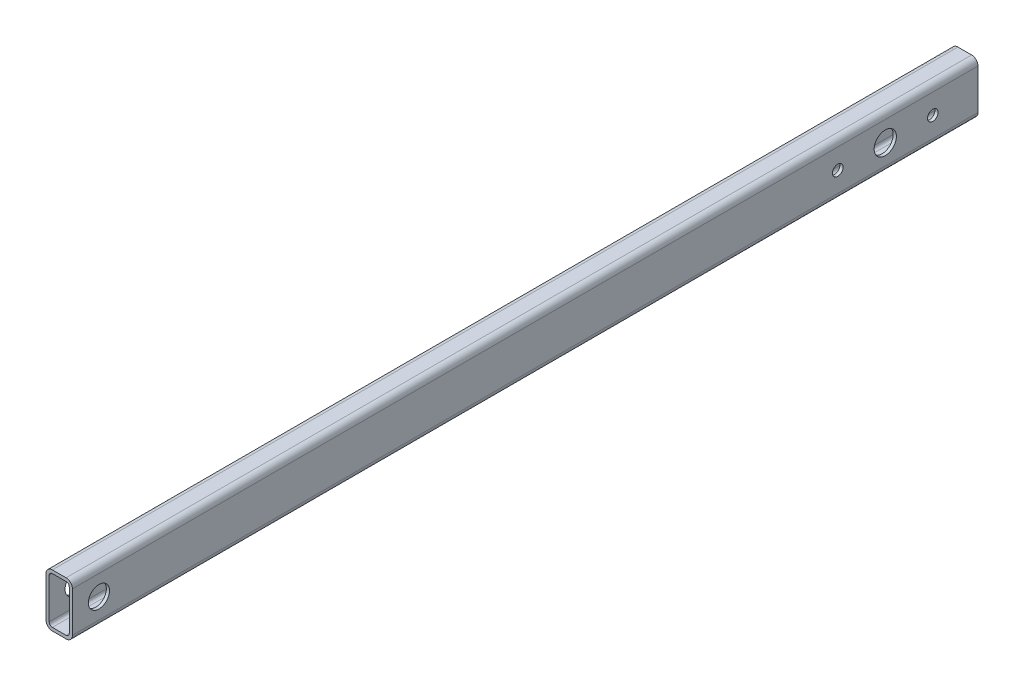
ISO-10303-21;
HEADER;
FILE_DESCRIPTION(('STEP AP214'),'2;1');
FILE_NAME('part.step','',(''),(''),'','','');
FILE_SCHEMA(('AUTOMOTIVE_DESIGN { 1 0 10303 214 1 1 1 1 }'));
ENDSEC;
DATA;
#1=APPLICATION_CONTEXT('core data for automotive mechanical design processes');
#2=APPLICATION_PROTOCOL_DEFINITION('international standard','automotive_design',2000,#1);
#3=PRODUCT_CONTEXT('',#1,'mechanical');
#4=PRODUCT('Part','Part','',(#3));
#5=PRODUCT_RELATED_PRODUCT_CATEGORY('part','',(#4));
#6=PRODUCT_DEFINITION_FORMATION('','',#4);
#7=PRODUCT_DEFINITION_CONTEXT('part definition',#1,'design');
#8=PRODUCT_DEFINITION('design','',#6,#7);
#9=PRODUCT_DEFINITION_SHAPE('','',#8);
#10=(LENGTH_UNIT() NAMED_UNIT(*) SI_UNIT(.MILLI.,.METRE.));
#11=(NAMED_UNIT(*) PLANE_ANGLE_UNIT() SI_UNIT($,.RADIAN.));
#12=(NAMED_UNIT(*) SI_UNIT($,.STERADIAN.) SOLID_ANGLE_UNIT());
#13=UNCERTAINTY_MEASURE_WITH_UNIT(LENGTH_MEASURE(1.E-05),#10,'distance_accuracy_value','');
#14=(GEOMETRIC_REPRESENTATION_CONTEXT(3) GLOBAL_UNCERTAINTY_ASSIGNED_CONTEXT((#13)) GLOBAL_UNIT_ASSIGNED_CONTEXT((#10,
#11,#12)) REPRESENTATION_CONTEXT('',''));
#15=CARTESIAN_POINT('',(0.,0.,0.));
#16=DIRECTION('',(0.,0.,1.));
#17=DIRECTION('',(1.,0.,0.));
#18=AXIS2_PLACEMENT_3D('',#15,#16,#17);
#19=CARTESIAN_POINT('',(6.00000000000009,5.99999999999989,-70.));
#20=DIRECTION('',(0.,0.,1.));
#21=DIRECTION('',(1.00000000000001,0.,0.));
#22=AXIS2_PLACEMENT_3D('',#19,#20,#21);
#23=CYLINDRICAL_SURFACE('',#22,6.);
#24=DIRECTION('',(0.,0.,1.));
#25=VECTOR('',#24,1.);
#26=CARTESIAN_POINT('',(6.00000000000009,0.,-70.0000000000003));
#27=LINE('',#26,#25);
#28=CARTESIAN_POINT('',(6.00000000000009,0.,-70.0000000000003));
#29=VERTEX_POINT('',#28);
#30=CARTESIAN_POINT('',(6.00000000000001,0.,785.));
#31=VERTEX_POINT('',#30);
#32=EDGE_CURVE('E272',#29,#31,#27,.T.);
#33=ORIENTED_EDGE('',*,*,#32,.T.);
#34=CARTESIAN_POINT('',(6.00000000000001,6.00000000000001,785.));
#35=DIRECTION('',(0.,0.,1.));
#36=DIRECTION('',(-1.00000000000001,0.,0.));
#37=AXIS2_PLACEMENT_3D('',#34,#35,#36);
#38=CIRCLE('',#37,6.);
#39=CARTESIAN_POINT('',(0.,6.00000000000001,785.));
#40=VERTEX_POINT('',#39);
#41=EDGE_CURVE('E196',#40,#31,#38,.T.);
#42=ORIENTED_EDGE('',*,*,#41,.F.);
#43=DIRECTION('',(0.,0.,1.));
#44=VECTOR('',#43,1.);
#45=CARTESIAN_POINT('',(0.,5.99999999999989,-70.0000000000006));
#46=LINE('',#45,#44);
#47=CARTESIAN_POINT('',(0.,5.99999999999989,-70.0000000000006));
#48=VERTEX_POINT('',#47);
#49=EDGE_CURVE('E11',#48,#40,#46,.T.);
#50=ORIENTED_EDGE('',*,*,#49,.F.);
#51=CARTESIAN_POINT('',(6.00000000000009,5.99999999999989,-70.));
#52=DIRECTION('',(0.,0.,1.));
#53=DIRECTION('',(-1.00000000000001,0.,0.));
#54=AXIS2_PLACEMENT_3D('',#51,#52,#53);
#55=CIRCLE('',#54,6.);
#56=EDGE_CURVE('E239',#48,#29,#55,.T.);
#57=ORIENTED_EDGE('',*,*,#56,.T.);
#58=EDGE_LOOP('',(#33,#42,#50,#57));
#59=FACE_BOUND('',#58,.T.);
#60=ADVANCED_FACE('F38',(#59),#23,.T.);
#61=CARTESIAN_POINT('',(0.,43.9999999999999,-70.));
#62=DIRECTION('',(-1.00000000000001,0.,0.));
#63=DIRECTION('',(0.,0.,1.));
#64=AXIS2_PLACEMENT_3D('',#61,#62,#63);
#65=PLANE('',#64);
#66=CARTESIAN_POINT('',(0.,24.9999999999998,-27.2997088405868));
#67=DIRECTION('',(1.00000000000001,0.,0.));
#68=DIRECTION('',(0.,1.00000000000001,0.));
#69=AXIS2_PLACEMENT_3D('',#66,#67,#68);
#70=CIRCLE('',#69,5.);
#71=CARTESIAN_POINT('',(0.,29.9999999999998,-27.2997088405868));
#72=VERTEX_POINT('',#71);
#73=EDGE_CURVE('E454',#72,#72,#70,.T.);
#74=ORIENTED_EDGE('',*,*,#73,.T.);
#75=EDGE_LOOP('',(#74));
#76=FACE_BOUND('',#75,.T.);
#77=CARTESIAN_POINT('',(0.,24.9999999999998,760.));
#78=DIRECTION('',(1.00000000000001,0.,0.));
#79=DIRECTION('',(0.,1.00000000000001,0.));
#80=AXIS2_PLACEMENT_3D('',#77,#78,#79);
#81=CIRCLE('',#80,9.99999999999998);
#82=CARTESIAN_POINT('',(0.,34.9999999999998,760.));
#83=VERTEX_POINT('',#82);
#84=EDGE_CURVE('E459',#83,#83,#81,.T.);
#85=ORIENTED_EDGE('',*,*,#84,.T.);
#86=EDGE_LOOP('',(#85));
#87=FACE_BOUND('',#86,.T.);
#88=CARTESIAN_POINT('',(0.,25.0000000000001,62.4002911594126));
#89=DIRECTION('',(1.00000000000001,0.,0.));
#90=DIRECTION('',(0.,1.00000000000001,0.));
#91=AXIS2_PLACEMENT_3D('',#88,#89,#90);
#92=CIRCLE('',#91,5.);
#93=CARTESIAN_POINT('',(0.,30.0000000000002,62.4002911594126));
#94=VERTEX_POINT('',#93);
#95=EDGE_CURVE('E451',#94,#94,#92,.T.);
#96=ORIENTED_EDGE('',*,*,#95,.T.);
#97=EDGE_LOOP('',(#96));
#98=FACE_BOUND('',#97,.T.);
#99=CARTESIAN_POINT('',(0.,25.0000000000001,17.5502911594126));
#100=DIRECTION('',(1.00000000000001,0.,0.));
#101=DIRECTION('',(0.,1.00000000000001,0.));
#102=AXIS2_PLACEMENT_3D('',#99,#100,#101);
#103=CIRCLE('',#102,10.5);
#104=CARTESIAN_POINT('',(0.,35.5000000000002,17.5502911594126));
#105=VERTEX_POINT('',#104);
#106=EDGE_CURVE('E290',#105,#105,#103,.T.);
#107=ORIENTED_EDGE('',*,*,#106,.T.);
#108=EDGE_LOOP('',(#107));
#109=FACE_BOUND('',#108,.T.);
#110=ORIENTED_EDGE('',*,*,#49,.T.);
#111=DIRECTION('',(0.,-1.00000000000001,0.));
#112=VECTOR('',#111,1.);
#113=CARTESIAN_POINT('',(0.,44.,785.));
#114=LINE('',#113,#112);
#115=CARTESIAN_POINT('',(0.,44.,785.));
#116=VERTEX_POINT('',#115);
#117=EDGE_CURVE('E217',#116,#40,#114,.T.);
#118=ORIENTED_EDGE('',*,*,#117,.F.);
#119=DIRECTION('',(0.,0.,1.));
#120=VECTOR('',#119,1.);
#121=CARTESIAN_POINT('',(0.,43.9999999999999,-70.));
#122=LINE('',#121,#120);
#123=CARTESIAN_POINT('',(0.,43.9999999999999,-70.));
#124=VERTEX_POINT('',#123);
#125=EDGE_CURVE('E46',#124,#116,#122,.T.);
#126=ORIENTED_EDGE('',*,*,#125,.F.);
#127=DIRECTION('',(0.,-1.00000000000001,0.));
#128=VECTOR('',#127,1.);
#129=CARTESIAN_POINT('',(0.,43.9999999999999,-70.));
#130=LINE('',#129,#128);
#131=EDGE_CURVE('E270',#124,#48,#130,.T.);
#132=ORIENTED_EDGE('',*,*,#131,.T.);
#133=EDGE_LOOP('',(#110,#118,#126,#132));
#134=FACE_BOUND('',#133,.T.);
#135=ADVANCED_FACE('F338',(#76,#87,#98,#109,#134),#65,.T.);
#136=CARTESIAN_POINT('',(6.00000000000009,43.9999999999999,-70.0000000000003));
#137=DIRECTION('',(0.,0.,1.));
#138=DIRECTION('',(1.00000000000001,0.,0.));
#139=AXIS2_PLACEMENT_3D('',#136,#137,#138);
#140=CYLINDRICAL_SURFACE('',#139,6.);
#141=ORIENTED_EDGE('',*,*,#125,.T.);
#142=CARTESIAN_POINT('',(6.00000000000009,44.,785.));
#143=DIRECTION('',(0.,0.,1.));
#144=DIRECTION('',(1.00000000000001,0.,0.));
#145=AXIS2_PLACEMENT_3D('',#142,#143,#144);
#146=CIRCLE('',#145,6.);
#147=CARTESIAN_POINT('',(6.00000000000009,50.,785.));
#148=VERTEX_POINT('',#147);
#149=EDGE_CURVE('E214',#148,#116,#146,.T.);
#150=ORIENTED_EDGE('',*,*,#149,.F.);
#151=DIRECTION('',(0.,0.,1.));
#152=VECTOR('',#151,1.);
#153=CARTESIAN_POINT('',(6.00000000000009,50.,-70.0000000000003));
#154=LINE('',#153,#152);
#155=CARTESIAN_POINT('',(6.00000000000009,50.,-70.0000000000003));
#156=VERTEX_POINT('',#155);
#157=EDGE_CURVE('E275',#156,#148,#154,.T.);
#158=ORIENTED_EDGE('',*,*,#157,.F.);
#159=CARTESIAN_POINT('',(6.00000000000009,43.9999999999999,-70.0000000000003));
#160=DIRECTION('',(0.,0.,1.));
#161=DIRECTION('',(1.00000000000001,0.,0.));
#162=AXIS2_PLACEMENT_3D('',#159,#160,#161);
#163=CIRCLE('',#162,6.);
#164=EDGE_CURVE('E267',#156,#124,#163,.T.);
#165=ORIENTED_EDGE('',*,*,#164,.T.);
#166=EDGE_LOOP('',(#141,#150,#158,#165));
#167=FACE_BOUND('',#166,.T.);
#168=ADVANCED_FACE('F342',(#167),#140,.T.);
#169=CARTESIAN_POINT('',(6.00000000000009,50.,-70.0000000000003));
#170=DIRECTION('',(0.,1.00000000000001,0.));
#171=DIRECTION('',(0.,0.,1.));
#172=AXIS2_PLACEMENT_3D('',#169,#170,#171);
#173=PLANE('',#172);
#174=ORIENTED_EDGE('',*,*,#157,.T.);
#175=DIRECTION('',(-1.00000000000001,0.,0.));
#176=VECTOR('',#175,1.);
#177=CARTESIAN_POINT('',(6.00000000000009,50.,785.));
#178=LINE('',#177,#176);
#179=CARTESIAN_POINT('',(18.9611964303453,50.,785.));
#180=VERTEX_POINT('',#179);
#181=EDGE_CURVE('E211',#180,#148,#178,.T.);
#182=ORIENTED_EDGE('',*,*,#181,.F.);
#183=DIRECTION('',(0.,0.,1.));
#184=VECTOR('',#183,1.);
#185=CARTESIAN_POINT('',(18.9611964303453,50.,-70.0000000000003));
#186=LINE('',#185,#184);
#187=CARTESIAN_POINT('',(18.9611964303453,50.,-70.0000000000003));
#188=VERTEX_POINT('',#187);
#189=EDGE_CURVE('E277',#188,#180,#186,.T.);
#190=ORIENTED_EDGE('',*,*,#189,.F.);
#191=DIRECTION('',(-1.00000000000001,0.,0.));
#192=VECTOR('',#191,1.);
#193=CARTESIAN_POINT('',(6.00000000000009,50.,-70.0000000000003));
#194=LINE('',#193,#192);
#195=EDGE_CURVE('E264',#188,#156,#194,.T.);
#196=ORIENTED_EDGE('',*,*,#195,.T.);
#197=EDGE_LOOP('',(#174,#182,#190,#196));
#198=FACE_BOUND('',#197,.T.);
#199=ADVANCED_FACE('F371',(#198),#173,.T.);
#200=CARTESIAN_POINT('',(18.9611964303453,44.,-70.0000000000003));
#201=DIRECTION('',(0.,0.,1.));
#202=DIRECTION('',(1.00000000000001,0.,0.));
#203=AXIS2_PLACEMENT_3D('',#200,#201,#202);
#204=CYLINDRICAL_SURFACE('',#203,6.00000000000001);
#205=ORIENTED_EDGE('',*,*,#189,.T.);
#206=CARTESIAN_POINT('',(18.9611964303453,44.,785.));
#207=DIRECTION('',(0.,0.,1.));
#208=DIRECTION('',(-1.00000000000001,0.,0.));
#209=AXIS2_PLACEMENT_3D('',#206,#207,#208);
#210=CIRCLE('',#209,6.00000000000001);
#211=CARTESIAN_POINT('',(24.9611964303453,44.,785.));
#212=VERTEX_POINT('',#211);
#213=EDGE_CURVE('E208',#212,#180,#210,.T.);
#214=ORIENTED_EDGE('',*,*,#213,.F.);
#215=DIRECTION('',(0.,0.,1.));
#216=VECTOR('',#215,1.);
#217=CARTESIAN_POINT('',(24.9611964303459,44.,-70.0000000000003));
#218=LINE('',#217,#216);
#219=CARTESIAN_POINT('',(24.9611964303459,44.,-70.0000000000003));
#220=VERTEX_POINT('',#219);
#221=EDGE_CURVE('E279',#220,#212,#218,.T.);
#222=ORIENTED_EDGE('',*,*,#221,.F.);
#223=CARTESIAN_POINT('',(18.9611964303453,44.,-70.0000000000003));
#224=DIRECTION('',(0.,0.,1.));
#225=DIRECTION('',(-1.00000000000001,0.,0.));
#226=AXIS2_PLACEMENT_3D('',#223,#224,#225);
#227=CIRCLE('',#226,6.00000000000001);
#228=EDGE_CURVE('E261',#220,#188,#227,.T.);
#229=ORIENTED_EDGE('',*,*,#228,.T.);
#230=EDGE_LOOP('',(#205,#214,#222,#229));
#231=FACE_BOUND('',#230,.T.);
#232=ADVANCED_FACE('F369',(#231),#204,.T.);
#233=CARTESIAN_POINT('',(24.9611964303459,44.,-70.0000000000003));
#234=DIRECTION('',(1.00000000000001,0.,0.));
#235=DIRECTION('',(0.,1.00000000000001,0.));
#236=AXIS2_PLACEMENT_3D('',#233,#234,#235);
#237=PLANE('',#236);
#238=CARTESIAN_POINT('',(24.9611964303452,24.9999999999998,-27.2997088405871));
#239=DIRECTION('',(1.00000000000001,0.,0.));
#240=DIRECTION('',(0.,1.00000000000001,0.));
#241=AXIS2_PLACEMENT_3D('',#238,#239,#240);
#242=CIRCLE('',#241,5.);
#243=CARTESIAN_POINT('',(24.9611964303452,29.9999999999998,-27.2997088405871));
#244=VERTEX_POINT('',#243);
#245=EDGE_CURVE('E457',#244,#244,#242,.T.);
#246=ORIENTED_EDGE('',*,*,#245,.F.);
#247=EDGE_LOOP('',(#246));
#248=FACE_BOUND('',#247,.T.);
#249=CARTESIAN_POINT('',(24.9611964303452,24.9999999999998,760.));
#250=DIRECTION('',(1.00000000000001,0.,0.));
#251=DIRECTION('',(0.,1.00000000000001,0.));
#252=AXIS2_PLACEMENT_3D('',#249,#250,#251);
#253=CIRCLE('',#252,9.99999999999998);
#254=CARTESIAN_POINT('',(24.9611964303452,34.9999999999998,760.));
#255=VERTEX_POINT('',#254);
#256=EDGE_CURVE('E462',#255,#255,#253,.T.);
#257=ORIENTED_EDGE('',*,*,#256,.F.);
#258=EDGE_LOOP('',(#257));
#259=FACE_BOUND('',#258,.T.);
#260=CARTESIAN_POINT('',(24.9611964303452,25.0000000000001,62.4002911594126));
#261=DIRECTION('',(1.00000000000001,0.,0.));
#262=DIRECTION('',(0.,1.00000000000001,0.));
#263=AXIS2_PLACEMENT_3D('',#260,#261,#262);
#264=CIRCLE('',#263,5.);
#265=CARTESIAN_POINT('',(24.9611964303452,30.0000000000002,62.4002911594126));
#266=VERTEX_POINT('',#265);
#267=EDGE_CURVE('E447',#266,#266,#264,.T.);
#268=ORIENTED_EDGE('',*,*,#267,.F.);
#269=EDGE_LOOP('',(#268));
#270=FACE_BOUND('',#269,.T.);
#271=CARTESIAN_POINT('',(24.9611964303452,25.0000000000001,17.5502911594126));
#272=DIRECTION('',(1.00000000000001,0.,0.));
#273=DIRECTION('',(0.,1.00000000000001,0.));
#274=AXIS2_PLACEMENT_3D('',#271,#272,#273);
#275=CIRCLE('',#274,10.5);
#276=CARTESIAN_POINT('',(24.9611964303452,35.5000000000002,17.5502911594126));
#277=VERTEX_POINT('',#276);
#278=EDGE_CURVE('E433',#277,#277,#275,.T.);
#279=ORIENTED_EDGE('',*,*,#278,.F.);
#280=EDGE_LOOP('',(#279));
#281=FACE_BOUND('',#280,.T.);
#282=ORIENTED_EDGE('',*,*,#221,.T.);
#283=DIRECTION('',(0.,1.00000000000001,0.));
#284=VECTOR('',#283,1.);
#285=CARTESIAN_POINT('',(24.9611964303453,44.,785.));
#286=LINE('',#285,#284);
#287=CARTESIAN_POINT('',(24.9611964303453,6.00000000000001,785.));
#288=VERTEX_POINT('',#287);
#289=EDGE_CURVE('E205',#288,#212,#286,.T.);
#290=ORIENTED_EDGE('',*,*,#289,.F.);
#291=DIRECTION('',(0.,0.,1.));
#292=VECTOR('',#291,1.);
#293=CARTESIAN_POINT('',(24.9611964303453,5.99999999999989,-70.));
#294=LINE('',#293,#292);
#295=CARTESIAN_POINT('',(24.9611964303453,5.99999999999989,-70.));
#296=VERTEX_POINT('',#295);
#297=EDGE_CURVE('E281',#296,#288,#294,.T.);
#298=ORIENTED_EDGE('',*,*,#297,.F.);
#299=DIRECTION('',(0.,1.00000000000001,0.));
#300=VECTOR('',#299,1.);
#301=CARTESIAN_POINT('',(24.9611964303459,44.,-70.0000000000003));
#302=LINE('',#301,#300);
#303=EDGE_CURVE('E258',#296,#220,#302,.T.);
#304=ORIENTED_EDGE('',*,*,#303,.T.);
#305=EDGE_LOOP('',(#282,#290,#298,#304));
#306=FACE_BOUND('',#305,.T.);
#307=ADVANCED_FACE('F367',(#248,#259,#270,#281,#306),#237,.T.);
#308=CARTESIAN_POINT('',(18.9611964303453,5.99999999999989,-70.));
#309=DIRECTION('',(0.,0.,1.));
#310=DIRECTION('',(1.00000000000001,0.,0.));
#311=AXIS2_PLACEMENT_3D('',#308,#309,#310);
#312=CYLINDRICAL_SURFACE('',#311,6.);
#313=ORIENTED_EDGE('',*,*,#297,.T.);
#314=CARTESIAN_POINT('',(18.9611964303453,6.00000000000001,785.));
#315=DIRECTION('',(0.,0.,1.));
#316=DIRECTION('',(1.00000000000001,0.,0.));
#317=AXIS2_PLACEMENT_3D('',#314,#315,#316);
#318=CIRCLE('',#317,6.);
#319=CARTESIAN_POINT('',(18.9611964303453,0.,785.));
#320=VERTEX_POINT('',#319);
#321=EDGE_CURVE('E202',#320,#288,#318,.T.);
#322=ORIENTED_EDGE('',*,*,#321,.F.);
#323=DIRECTION('',(0.,0.,1.));
#324=VECTOR('',#323,1.);
#325=CARTESIAN_POINT('',(18.9611964303453,0.,-70.0000000000003));
#326=LINE('',#325,#324);
#327=CARTESIAN_POINT('',(18.9611964303453,0.,-70.0000000000003));
#328=VERTEX_POINT('',#327);
#329=EDGE_CURVE('E283',#328,#320,#326,.T.);
#330=ORIENTED_EDGE('',*,*,#329,.F.);
#331=CARTESIAN_POINT('',(18.9611964303453,5.99999999999989,-70.));
#332=DIRECTION('',(0.,0.,1.));
#333=DIRECTION('',(1.00000000000001,0.,0.));
#334=AXIS2_PLACEMENT_3D('',#331,#332,#333);
#335=CIRCLE('',#334,6.);
#336=EDGE_CURVE('E255',#328,#296,#335,.T.);
#337=ORIENTED_EDGE('',*,*,#336,.T.);
#338=EDGE_LOOP('',(#313,#322,#330,#337));
#339=FACE_BOUND('',#338,.T.);
#340=ADVANCED_FACE('F363',(#339),#312,.T.);
#341=CARTESIAN_POINT('',(6.00000000000009,0.,-70.0000000000003));
#342=DIRECTION('',(0.,-1.00000000000001,0.));
#343=DIRECTION('',(0.,0.,-1.));
#344=AXIS2_PLACEMENT_3D('',#341,#342,#343);
#345=PLANE('',#344);
#346=ORIENTED_EDGE('',*,*,#329,.T.);
#347=DIRECTION('',(1.00000000000001,0.,0.));
#348=VECTOR('',#347,1.);
#349=CARTESIAN_POINT('',(6.00000000000001,0.,785.));
#350=LINE('',#349,#348);
#351=EDGE_CURVE('E199',#31,#320,#350,.T.);
#352=ORIENTED_EDGE('',*,*,#351,.F.);
#353=ORIENTED_EDGE('',*,*,#32,.F.);
#354=DIRECTION('',(1.00000000000001,0.,0.));
#355=VECTOR('',#354,1.);
#356=CARTESIAN_POINT('',(6.00000000000009,0.,-70.0000000000003));
#357=LINE('',#356,#355);
#358=EDGE_CURVE('E252',#29,#328,#357,.T.);
#359=ORIENTED_EDGE('',*,*,#358,.T.);
#360=EDGE_LOOP('',(#346,#352,#353,#359));
#361=FACE_BOUND('',#360,.T.);
#362=ADVANCED_FACE('F348',(#361),#345,.T.);
#363=CARTESIAN_POINT('',(6.00000000000009,5.99999999999989,-70.));
#364=DIRECTION('',(0.,0.,-1.));
#365=DIRECTION('',(-1.00000000000001,0.,0.));
#366=AXIS2_PLACEMENT_3D('',#363,#364,#365);
#367=PLANE('',#366);
#368=CARTESIAN_POINT('',(6.00000000000009,5.99999999999989,-70.));
#369=DIRECTION('',(0.,0.,1.));
#370=DIRECTION('',(-1.00000000000001,0.,0.));
#371=AXIS2_PLACEMENT_3D('',#368,#369,#370);
#372=CIRCLE('',#371,3.);
#373=CARTESIAN_POINT('',(3.00000000000009,5.99999999999989,-70.0000000000006));
#374=VERTEX_POINT('',#373);
#375=CARTESIAN_POINT('',(6.00000000000009,2.99999999999978,-70.0000000000003));
#376=VERTEX_POINT('',#375);
#377=EDGE_CURVE('E220',#374,#376,#372,.T.);
#378=ORIENTED_EDGE('',*,*,#377,.T.);
#379=DIRECTION('',(1.00000000000001,0.,0.));
#380=VECTOR('',#379,1.);
#381=CARTESIAN_POINT('',(6.00000000000009,2.99999999999978,-70.0000000000003));
#382=LINE('',#381,#380);
#383=CARTESIAN_POINT('',(18.9611964303453,2.99999999999978,-70.0000000000006));
#384=VERTEX_POINT('',#383);
#385=EDGE_CURVE('E158',#376,#384,#382,.T.);
#386=ORIENTED_EDGE('',*,*,#385,.T.);
#387=CARTESIAN_POINT('',(18.9611964303453,5.99999999999989,-70.));
#388=DIRECTION('',(0.,0.,1.));
#389=DIRECTION('',(1.00000000000001,0.,0.));
#390=AXIS2_PLACEMENT_3D('',#387,#388,#389);
#391=CIRCLE('',#390,3.);
#392=CARTESIAN_POINT('',(21.9611964303453,5.99999999999989,-70.));
#393=VERTEX_POINT('',#392);
#394=EDGE_CURVE('E54',#384,#393,#391,.T.);
#395=ORIENTED_EDGE('',*,*,#394,.T.);
#396=DIRECTION('',(0.,1.00000000000001,0.));
#397=VECTOR('',#396,1.);
#398=CARTESIAN_POINT('',(21.9611964303453,44.,-70.0000000000003));
#399=LINE('',#398,#397);
#400=CARTESIAN_POINT('',(21.9611964303453,44.,-70.0000000000003));
#401=VERTEX_POINT('',#400);
#402=EDGE_CURVE('E224',#393,#401,#399,.T.);
#403=ORIENTED_EDGE('',*,*,#402,.T.);
#404=CARTESIAN_POINT('',(18.9611964303453,44.,-70.0000000000003));
#405=DIRECTION('',(0.,0.,1.));
#406=DIRECTION('',(-1.00000000000001,0.,0.));
#407=AXIS2_PLACEMENT_3D('',#404,#405,#406);
#408=CIRCLE('',#407,3.);
#409=CARTESIAN_POINT('',(18.9611964303453,47.0000000000002,-70.0000000000003));
#410=VERTEX_POINT('',#409);
#411=EDGE_CURVE('E227',#401,#410,#408,.T.);
#412=ORIENTED_EDGE('',*,*,#411,.T.);
#413=DIRECTION('',(-1.00000000000001,0.,0.));
#414=VECTOR('',#413,1.);
#415=CARTESIAN_POINT('',(6.00000000000009,47.0000000000002,-70.0000000000003));
#416=LINE('',#415,#414);
#417=CARTESIAN_POINT('',(6.00000000000009,47.0000000000002,-70.0000000000003));
#418=VERTEX_POINT('',#417);
#419=EDGE_CURVE('E230',#410,#418,#416,.T.);
#420=ORIENTED_EDGE('',*,*,#419,.T.);
#421=CARTESIAN_POINT('',(6.00000000000009,43.9999999999999,-70.0000000000003));
#422=DIRECTION('',(0.,0.,1.));
#423=DIRECTION('',(1.00000000000001,0.,0.));
#424=AXIS2_PLACEMENT_3D('',#421,#422,#423);
#425=CIRCLE('',#424,3.);
#426=CARTESIAN_POINT('',(3.00000000000009,43.9999999999999,-70.));
#427=VERTEX_POINT('',#426);
#428=EDGE_CURVE('E233',#418,#427,#425,.T.);
#429=ORIENTED_EDGE('',*,*,#428,.T.);
#430=DIRECTION('',(0.,-1.00000000000001,0.));
#431=VECTOR('',#430,1.);
#432=CARTESIAN_POINT('',(3.00000000000009,43.9999999999999,-70.));
#433=LINE('',#432,#431);
#434=EDGE_CURVE('E163',#427,#374,#433,.T.);
#435=ORIENTED_EDGE('',*,*,#434,.T.);
#436=EDGE_LOOP('',(#378,#386,#395,#403,#412,#420,#429,#435));
#437=FACE_BOUND('',#436,.T.);
#438=ORIENTED_EDGE('',*,*,#56,.F.);
#439=ORIENTED_EDGE('',*,*,#131,.F.);
#440=ORIENTED_EDGE('',*,*,#164,.F.);
#441=ORIENTED_EDGE('',*,*,#195,.F.);
#442=ORIENTED_EDGE('',*,*,#228,.F.);
#443=ORIENTED_EDGE('',*,*,#303,.F.);
#444=ORIENTED_EDGE('',*,*,#336,.F.);
#445=ORIENTED_EDGE('',*,*,#358,.F.);
#446=EDGE_LOOP('',(#438,#439,#440,#441,#442,#443,#444,#445));
#447=FACE_BOUND('',#446,.T.);
#448=ADVANCED_FACE('F357',(#437,#447),#367,.T.);
#449=CARTESIAN_POINT('',(6.00000000000009,5.99999999999989,-70.));
#450=DIRECTION('',(0.,0.,1.));
#451=DIRECTION('',(1.00000000000001,0.,0.));
#452=AXIS2_PLACEMENT_3D('',#449,#450,#451);
#453=CYLINDRICAL_SURFACE('',#452,3.);
#454=DIRECTION('',(0.,0.,1.));
#455=VECTOR('',#454,1.);
#456=CARTESIAN_POINT('',(3.00000000000009,5.99999999999989,-70.0000000000006));
#457=LINE('',#456,#455);
#458=CARTESIAN_POINT('',(3.,6.00000000000001,785.));
#459=VERTEX_POINT('',#458);
#460=EDGE_CURVE('E168',#374,#459,#457,.T.);
#461=ORIENTED_EDGE('',*,*,#460,.T.);
#462=CARTESIAN_POINT('',(6.00000000000001,6.00000000000001,785.));
#463=DIRECTION('',(0.,0.,1.));
#464=DIRECTION('',(-1.00000000000001,0.,0.));
#465=AXIS2_PLACEMENT_3D('',#462,#463,#464);
#466=CIRCLE('',#465,3.);
#467=CARTESIAN_POINT('',(6.00000000000001,3.00000000000011,785.));
#468=VERTEX_POINT('',#467);
#469=EDGE_CURVE('E166',#459,#468,#466,.T.);
#470=ORIENTED_EDGE('',*,*,#469,.T.);
#471=DIRECTION('',(0.,0.,1.));
#472=VECTOR('',#471,1.);
#473=CARTESIAN_POINT('',(6.00000000000009,2.99999999999978,-70.0000000000003));
#474=LINE('',#473,#472);
#475=EDGE_CURVE('E151',#376,#468,#474,.T.);
#476=ORIENTED_EDGE('',*,*,#475,.F.);
#477=ORIENTED_EDGE('',*,*,#377,.F.);
#478=EDGE_LOOP('',(#461,#470,#476,#477));
#479=FACE_BOUND('',#478,.T.);
#480=ADVANCED_FACE('F167',(#479),#453,.F.);
#481=CARTESIAN_POINT('',(3.00000000000009,43.9999999999999,-70.));
#482=DIRECTION('',(-1.00000000000001,0.,0.));
#483=DIRECTION('',(0.,0.,1.));
#484=AXIS2_PLACEMENT_3D('',#481,#482,#483);
#485=PLANE('',#484);
#486=CARTESIAN_POINT('',(3.,24.9999999999998,-27.2997088405868));
#487=DIRECTION('',(-1.00000000000001,0.,0.));
#488=DIRECTION('',(0.,0.,1.));
#489=AXIS2_PLACEMENT_3D('',#486,#487,#488);
#490=CIRCLE('',#489,5.);
#491=CARTESIAN_POINT('',(3.,24.9999999999998,-22.2997088405868));
#492=VERTEX_POINT('',#491);
#493=EDGE_CURVE('E172',#492,#492,#490,.T.);
#494=ORIENTED_EDGE('',*,*,#493,.T.);
#495=EDGE_LOOP('',(#494));
#496=FACE_BOUND('',#495,.T.);
#497=CARTESIAN_POINT('',(3.,24.9999999999998,760.));
#498=DIRECTION('',(-1.00000000000001,0.,0.));
#499=DIRECTION('',(0.,0.,1.));
#500=AXIS2_PLACEMENT_3D('',#497,#498,#499);
#501=CIRCLE('',#500,9.99999999999998);
#502=CARTESIAN_POINT('',(3.,24.9999999999998,770.));
#503=VERTEX_POINT('',#502);
#504=EDGE_CURVE('E296',#503,#503,#501,.T.);
#505=ORIENTED_EDGE('',*,*,#504,.T.);
#506=EDGE_LOOP('',(#505));
#507=FACE_BOUND('',#506,.T.);
#508=CARTESIAN_POINT('',(3.,25.0000000000001,62.4002911594126));
#509=DIRECTION('',(-1.00000000000001,0.,0.));
#510=DIRECTION('',(0.,0.,1.));
#511=AXIS2_PLACEMENT_3D('',#508,#509,#510);
#512=CIRCLE('',#511,5.);
#513=CARTESIAN_POINT('',(3.,25.0000000000001,67.4002911594126));
#514=VERTEX_POINT('',#513);
#515=EDGE_CURVE('E293',#514,#514,#512,.T.);
#516=ORIENTED_EDGE('',*,*,#515,.T.);
#517=EDGE_LOOP('',(#516));
#518=FACE_BOUND('',#517,.T.);
#519=CARTESIAN_POINT('',(3.,25.0000000000001,17.5502911594126));
#520=DIRECTION('',(-1.00000000000001,0.,0.));
#521=DIRECTION('',(0.,0.,1.));
#522=AXIS2_PLACEMENT_3D('',#519,#520,#521);
#523=CIRCLE('',#522,10.5);
#524=CARTESIAN_POINT('',(3.,25.0000000000001,28.0502911594126));
#525=VERTEX_POINT('',#524);
#526=EDGE_CURVE('E289',#525,#525,#523,.T.);
#527=ORIENTED_EDGE('',*,*,#526,.T.);
#528=EDGE_LOOP('',(#527));
#529=FACE_BOUND('',#528,.T.);
#530=DIRECTION('',(0.,0.,1.));
#531=VECTOR('',#530,1.);
#532=CARTESIAN_POINT('',(3.00000000000009,43.9999999999999,-70.));
#533=LINE('',#532,#531);
#534=CARTESIAN_POINT('',(3.00000000000009,44.,785.));
#535=VERTEX_POINT('',#534);
#536=EDGE_CURVE('E240',#427,#535,#533,.T.);
#537=ORIENTED_EDGE('',*,*,#536,.T.);
#538=DIRECTION('',(0.,-1.00000000000001,0.));
#539=VECTOR('',#538,1.);
#540=CARTESIAN_POINT('',(3.00000000000009,44.,785.));
#541=LINE('',#540,#539);
#542=EDGE_CURVE('E194',#535,#459,#541,.T.);
#543=ORIENTED_EDGE('',*,*,#542,.T.);
#544=ORIENTED_EDGE('',*,*,#460,.F.);
#545=ORIENTED_EDGE('',*,*,#434,.F.);
#546=EDGE_LOOP('',(#537,#543,#544,#545));
#547=FACE_BOUND('',#546,.T.);
#548=ADVANCED_FACE('F396',(#496,#507,#518,#529,#547),#485,.F.);
#549=CARTESIAN_POINT('',(6.00000000000009,43.9999999999999,-70.0000000000003));
#550=DIRECTION('',(0.,0.,1.));
#551=DIRECTION('',(1.00000000000001,0.,0.));
#552=AXIS2_PLACEMENT_3D('',#549,#550,#551);
#553=CYLINDRICAL_SURFACE('',#552,3.);
#554=DIRECTION('',(0.,0.,1.));
#555=VECTOR('',#554,1.);
#556=CARTESIAN_POINT('',(6.00000000000009,47.0000000000002,-70.0000000000003));
#557=LINE('',#556,#555);
#558=CARTESIAN_POINT('',(6.00000000000009,47.0000000000002,785.));
#559=VERTEX_POINT('',#558);
#560=EDGE_CURVE('E242',#418,#559,#557,.T.);
#561=ORIENTED_EDGE('',*,*,#560,.T.);
#562=CARTESIAN_POINT('',(6.00000000000009,44.,785.));
#563=DIRECTION('',(0.,0.,1.));
#564=DIRECTION('',(1.00000000000001,0.,0.));
#565=AXIS2_PLACEMENT_3D('',#562,#563,#564);
#566=CIRCLE('',#565,3.);
#567=EDGE_CURVE('E191',#559,#535,#566,.T.);
#568=ORIENTED_EDGE('',*,*,#567,.T.);
#569=ORIENTED_EDGE('',*,*,#536,.F.);
#570=ORIENTED_EDGE('',*,*,#428,.F.);
#571=EDGE_LOOP('',(#561,#568,#569,#570));
#572=FACE_BOUND('',#571,.T.);
#573=ADVANCED_FACE('F413',(#572),#553,.F.);
#574=CARTESIAN_POINT('',(6.00000000000009,47.0000000000002,-70.0000000000003));
#575=DIRECTION('',(0.,1.00000000000001,0.));
#576=DIRECTION('',(0.,0.,1.));
#577=AXIS2_PLACEMENT_3D('',#574,#575,#576);
#578=PLANE('',#577);
#579=DIRECTION('',(0.,0.,1.));
#580=VECTOR('',#579,1.);
#581=CARTESIAN_POINT('',(18.9611964303453,47.0000000000002,-70.0000000000003));
#582=LINE('',#581,#580);
#583=CARTESIAN_POINT('',(18.9611964303453,47.0000000000002,785.));
#584=VERTEX_POINT('',#583);
#585=EDGE_CURVE('E244',#410,#584,#582,.T.);
#586=ORIENTED_EDGE('',*,*,#585,.T.);
#587=DIRECTION('',(-1.00000000000001,0.,0.));
#588=VECTOR('',#587,1.);
#589=CARTESIAN_POINT('',(6.00000000000009,47.0000000000002,785.));
#590=LINE('',#589,#588);
#591=EDGE_CURVE('E188',#584,#559,#590,.T.);
#592=ORIENTED_EDGE('',*,*,#591,.T.);
#593=ORIENTED_EDGE('',*,*,#560,.F.);
#594=ORIENTED_EDGE('',*,*,#419,.F.);
#595=EDGE_LOOP('',(#586,#592,#593,#594));
#596=FACE_BOUND('',#595,.T.);
#597=ADVANCED_FACE('F409',(#596),#578,.F.);
#598=CARTESIAN_POINT('',(18.9611964303453,44.,-70.0000000000003));
#599=DIRECTION('',(0.,0.,1.));
#600=DIRECTION('',(1.00000000000001,0.,0.));
#601=AXIS2_PLACEMENT_3D('',#598,#599,#600);
#602=CYLINDRICAL_SURFACE('',#601,3.);
#603=DIRECTION('',(0.,0.,1.));
#604=VECTOR('',#603,1.);
#605=CARTESIAN_POINT('',(21.9611964303453,44.,-70.0000000000003));
#606=LINE('',#605,#604);
#607=CARTESIAN_POINT('',(21.9611964303453,44.,785.));
#608=VERTEX_POINT('',#607);
#609=EDGE_CURVE('E246',#401,#608,#606,.T.);
#610=ORIENTED_EDGE('',*,*,#609,.T.);
#611=CARTESIAN_POINT('',(18.9611964303453,44.,785.));
#612=DIRECTION('',(0.,0.,1.));
#613=DIRECTION('',(-1.00000000000001,0.,0.));
#614=AXIS2_PLACEMENT_3D('',#611,#612,#613);
#615=CIRCLE('',#614,3.);
#616=EDGE_CURVE('E185',#608,#584,#615,.T.);
#617=ORIENTED_EDGE('',*,*,#616,.T.);
#618=ORIENTED_EDGE('',*,*,#585,.F.);
#619=ORIENTED_EDGE('',*,*,#411,.F.);
#620=EDGE_LOOP('',(#610,#617,#618,#619));
#621=FACE_BOUND('',#620,.T.);
#622=ADVANCED_FACE('F406',(#621),#602,.F.);
#623=CARTESIAN_POINT('',(21.9611964303453,44.,-70.0000000000003));
#624=DIRECTION('',(1.00000000000001,0.,0.));
#625=DIRECTION('',(0.,0.,-1.));
#626=AXIS2_PLACEMENT_3D('',#623,#624,#625);
#627=PLANE('',#626);
#628=CARTESIAN_POINT('',(21.9611964303452,24.9999999999998,-27.2997088405871));
#629=DIRECTION('',(1.00000000000001,0.,0.));
#630=DIRECTION('',(0.,0.,-1.));
#631=AXIS2_PLACEMENT_3D('',#628,#629,#630);
#632=CIRCLE('',#631,5.);
#633=CARTESIAN_POINT('',(21.9611964303452,24.9999999999998,-32.2997088405871));
#634=VERTEX_POINT('',#633);
#635=EDGE_CURVE('E41',#634,#634,#632,.T.);
#636=ORIENTED_EDGE('',*,*,#635,.T.);
#637=EDGE_LOOP('',(#636));
#638=FACE_BOUND('',#637,.T.);
#639=CARTESIAN_POINT('',(21.9611964303452,24.9999999999998,760.));
#640=DIRECTION('',(1.00000000000001,0.,0.));
#641=DIRECTION('',(0.,0.,-1.));
#642=AXIS2_PLACEMENT_3D('',#639,#640,#641);
#643=CIRCLE('',#642,9.99999999999998);
#644=CARTESIAN_POINT('',(21.9611964303452,24.9999999999998,750.));
#645=VERTEX_POINT('',#644);
#646=EDGE_CURVE('E294',#645,#645,#643,.T.);
#647=ORIENTED_EDGE('',*,*,#646,.T.);
#648=EDGE_LOOP('',(#647));
#649=FACE_BOUND('',#648,.T.);
#650=CARTESIAN_POINT('',(21.9611964303452,25.0000000000001,62.4002911594126));
#651=DIRECTION('',(1.00000000000001,0.,0.));
#652=DIRECTION('',(0.,0.,-1.));
#653=AXIS2_PLACEMENT_3D('',#650,#651,#652);
#654=CIRCLE('',#653,5.);
#655=CARTESIAN_POINT('',(21.9611964303452,25.0000000000001,57.4002911594126));
#656=VERTEX_POINT('',#655);
#657=EDGE_CURVE('E291',#656,#656,#654,.T.);
#658=ORIENTED_EDGE('',*,*,#657,.T.);
#659=EDGE_LOOP('',(#658));
#660=FACE_BOUND('',#659,.T.);
#661=CARTESIAN_POINT('',(21.9611964303452,25.0000000000001,17.5502911594126));
#662=DIRECTION('',(1.00000000000001,0.,0.));
#663=DIRECTION('',(0.,0.,-1.));
#664=AXIS2_PLACEMENT_3D('',#661,#662,#663);
#665=CIRCLE('',#664,10.5);
#666=CARTESIAN_POINT('',(21.9611964303452,25.0000000000001,7.05029115941259));
#667=VERTEX_POINT('',#666);
#668=EDGE_CURVE('E286',#667,#667,#665,.T.);
#669=ORIENTED_EDGE('',*,*,#668,.T.);
#670=EDGE_LOOP('',(#669));
#671=FACE_BOUND('',#670,.T.);
#672=DIRECTION('',(0.,0.,1.));
#673=VECTOR('',#672,1.);
#674=CARTESIAN_POINT('',(21.9611964303453,5.99999999999989,-70.));
#675=LINE('',#674,#673);
#676=CARTESIAN_POINT('',(21.9611964303453,6.00000000000001,785.));
#677=VERTEX_POINT('',#676);
#678=EDGE_CURVE('E248',#393,#677,#675,.T.);
#679=ORIENTED_EDGE('',*,*,#678,.T.);
#680=DIRECTION('',(0.,1.00000000000001,0.));
#681=VECTOR('',#680,1.);
#682=CARTESIAN_POINT('',(21.9611964303453,44.,785.));
#683=LINE('',#682,#681);
#684=EDGE_CURVE('E179',#677,#608,#683,.T.);
#685=ORIENTED_EDGE('',*,*,#684,.T.);
#686=ORIENTED_EDGE('',*,*,#609,.F.);
#687=ORIENTED_EDGE('',*,*,#402,.F.);
#688=EDGE_LOOP('',(#679,#685,#686,#687));
#689=FACE_BOUND('',#688,.T.);
#690=ADVANCED_FACE('F313',(#638,#649,#660,#671,#689),#627,.F.);
#691=CARTESIAN_POINT('',(18.9611964303453,5.99999999999989,-70.));
#692=DIRECTION('',(0.,0.,1.));
#693=DIRECTION('',(1.00000000000001,0.,0.));
#694=AXIS2_PLACEMENT_3D('',#691,#692,#693);
#695=CYLINDRICAL_SURFACE('',#694,3.);
#696=DIRECTION('',(0.,0.,1.));
#697=VECTOR('',#696,1.);
#698=CARTESIAN_POINT('',(18.9611964303453,2.99999999999978,-70.0000000000006));
#699=LINE('',#698,#697);
#700=CARTESIAN_POINT('',(18.9611964303453,3.00000000000011,785.));
#701=VERTEX_POINT('',#700);
#702=EDGE_CURVE('E162',#384,#701,#699,.T.);
#703=ORIENTED_EDGE('',*,*,#702,.T.);
#704=CARTESIAN_POINT('',(18.9611964303453,6.00000000000001,785.));
#705=DIRECTION('',(0.,0.,1.));
#706=DIRECTION('',(1.00000000000001,0.,0.));
#707=AXIS2_PLACEMENT_3D('',#704,#705,#706);
#708=CIRCLE('',#707,3.);
#709=EDGE_CURVE('E177',#701,#677,#708,.T.);
#710=ORIENTED_EDGE('',*,*,#709,.T.);
#711=ORIENTED_EDGE('',*,*,#678,.F.);
#712=ORIENTED_EDGE('',*,*,#394,.F.);
#713=EDGE_LOOP('',(#703,#710,#711,#712));
#714=FACE_BOUND('',#713,.T.);
#715=ADVANCED_FACE('F401',(#714),#695,.F.);
#716=CARTESIAN_POINT('',(6.00000000000009,2.99999999999978,-70.0000000000003));
#717=DIRECTION('',(0.,-1.00000000000001,0.));
#718=DIRECTION('',(0.,0.,-1.));
#719=AXIS2_PLACEMENT_3D('',#716,#717,#718);
#720=PLANE('',#719);
#721=ORIENTED_EDGE('',*,*,#475,.T.);
#722=DIRECTION('',(1.00000000000001,0.,0.));
#723=VECTOR('',#722,1.);
#724=CARTESIAN_POINT('',(6.00000000000001,3.00000000000011,785.));
#725=LINE('',#724,#723);
#726=EDGE_CURVE('E155',#468,#701,#725,.T.);
#727=ORIENTED_EDGE('',*,*,#726,.T.);
#728=ORIENTED_EDGE('',*,*,#702,.F.);
#729=ORIENTED_EDGE('',*,*,#385,.F.);
#730=EDGE_LOOP('',(#721,#727,#728,#729));
#731=FACE_BOUND('',#730,.T.);
#732=ADVANCED_FACE('F153',(#731),#720,.F.);
#733=CARTESIAN_POINT('',(6.00000000000001,6.00000000000001,785.));
#734=DIRECTION('',(0.,0.,-1.));
#735=DIRECTION('',(-1.00000000000001,0.,0.));
#736=AXIS2_PLACEMENT_3D('',#733,#734,#735);
#737=PLANE('',#736);
#738=ORIENTED_EDGE('',*,*,#41,.T.);
#739=ORIENTED_EDGE('',*,*,#351,.T.);
#740=ORIENTED_EDGE('',*,*,#321,.T.);
#741=ORIENTED_EDGE('',*,*,#289,.T.);
#742=ORIENTED_EDGE('',*,*,#213,.T.);
#743=ORIENTED_EDGE('',*,*,#181,.T.);
#744=ORIENTED_EDGE('',*,*,#149,.T.);
#745=ORIENTED_EDGE('',*,*,#117,.T.);
#746=EDGE_LOOP('',(#738,#739,#740,#741,#742,#743,#744,#745));
#747=FACE_BOUND('',#746,.T.);
#748=ORIENTED_EDGE('',*,*,#469,.F.);
#749=ORIENTED_EDGE('',*,*,#542,.F.);
#750=ORIENTED_EDGE('',*,*,#567,.F.);
#751=ORIENTED_EDGE('',*,*,#591,.F.);
#752=ORIENTED_EDGE('',*,*,#616,.F.);
#753=ORIENTED_EDGE('',*,*,#684,.F.);
#754=ORIENTED_EDGE('',*,*,#709,.F.);
#755=ORIENTED_EDGE('',*,*,#726,.F.);
#756=EDGE_LOOP('',(#748,#749,#750,#751,#752,#753,#754,#755));
#757=FACE_BOUND('',#756,.T.);
#758=ADVANCED_FACE('F174',(#747,#757),#737,.F.);
#759=CARTESIAN_POINT('',(0.,25.0000000000001,17.5502911594126));
#760=DIRECTION('',(1.00000000000001,0.,0.));
#761=DIRECTION('',(0.,1.00000000000001,0.));
#762=AXIS2_PLACEMENT_3D('',#759,#760,#761);
#763=CYLINDRICAL_SURFACE('',#762,10.5);
#764=ORIENTED_EDGE('',*,*,#278,.T.);
#765=EDGE_LOOP('',(#764));
#766=FACE_BOUND('',#765,.T.);
#767=ORIENTED_EDGE('',*,*,#668,.F.);
#768=EDGE_LOOP('',(#767));
#769=FACE_BOUND('',#768,.T.);
#770=ADVANCED_FACE('F329',(#766,#769),#763,.F.);
#771=CARTESIAN_POINT('',(0.,25.0000000000001,62.4002911594126));
#772=DIRECTION('',(1.00000000000001,0.,0.));
#773=DIRECTION('',(0.,1.00000000000001,0.));
#774=AXIS2_PLACEMENT_3D('',#771,#772,#773);
#775=CYLINDRICAL_SURFACE('',#774,5.);
#776=ORIENTED_EDGE('',*,*,#267,.T.);
#777=EDGE_LOOP('',(#776));
#778=FACE_BOUND('',#777,.T.);
#779=ORIENTED_EDGE('',*,*,#657,.F.);
#780=EDGE_LOOP('',(#779));
#781=FACE_BOUND('',#780,.T.);
#782=ADVANCED_FACE('F330',(#778,#781),#775,.F.);
#783=CARTESIAN_POINT('',(0.,24.9999999999998,760.));
#784=DIRECTION('',(1.00000000000001,0.,0.));
#785=DIRECTION('',(0.,1.00000000000001,0.));
#786=AXIS2_PLACEMENT_3D('',#783,#784,#785);
#787=CYLINDRICAL_SURFACE('',#786,9.99999999999998);
#788=ORIENTED_EDGE('',*,*,#256,.T.);
#789=EDGE_LOOP('',(#788));
#790=FACE_BOUND('',#789,.T.);
#791=ORIENTED_EDGE('',*,*,#646,.F.);
#792=EDGE_LOOP('',(#791));
#793=FACE_BOUND('',#792,.T.);
#794=ADVANCED_FACE('F318',(#790,#793),#787,.F.);
#795=CARTESIAN_POINT('',(0.,24.9999999999998,-27.2997088405868));
#796=DIRECTION('',(1.00000000000001,0.,0.));
#797=DIRECTION('',(0.,1.00000000000001,0.));
#798=AXIS2_PLACEMENT_3D('',#795,#796,#797);
#799=CYLINDRICAL_SURFACE('',#798,5.);
#800=ORIENTED_EDGE('',*,*,#245,.T.);
#801=EDGE_LOOP('',(#800));
#802=FACE_BOUND('',#801,.T.);
#803=ORIENTED_EDGE('',*,*,#635,.F.);
#804=EDGE_LOOP('',(#803));
#805=FACE_BOUND('',#804,.T.);
#806=ADVANCED_FACE('F315',(#802,#805),#799,.F.);
#807=ORIENTED_EDGE('',*,*,#106,.F.);
#808=EDGE_LOOP('',(#807));
#809=FACE_BOUND('',#808,.T.);
#810=ORIENTED_EDGE('',*,*,#526,.F.);
#811=EDGE_LOOP('',(#810));
#812=FACE_BOUND('',#811,.T.);
#813=ADVANCED_FACE('F317',(#809,#812),#763,.F.);
#814=ORIENTED_EDGE('',*,*,#95,.F.);
#815=EDGE_LOOP('',(#814));
#816=FACE_BOUND('',#815,.T.);
#817=ORIENTED_EDGE('',*,*,#515,.F.);
#818=EDGE_LOOP('',(#817));
#819=FACE_BOUND('',#818,.T.);
#820=ADVANCED_FACE('F326',(#816,#819),#775,.F.);
#821=ORIENTED_EDGE('',*,*,#84,.F.);
#822=EDGE_LOOP('',(#821));
#823=FACE_BOUND('',#822,.T.);
#824=ORIENTED_EDGE('',*,*,#504,.F.);
#825=EDGE_LOOP('',(#824));
#826=FACE_BOUND('',#825,.T.);
#827=ADVANCED_FACE('F333',(#823,#826),#787,.F.);
#828=ORIENTED_EDGE('',*,*,#73,.F.);
#829=EDGE_LOOP('',(#828));
#830=FACE_BOUND('',#829,.T.);
#831=ORIENTED_EDGE('',*,*,#493,.F.);
#832=EDGE_LOOP('',(#831));
#833=FACE_BOUND('',#832,.T.);
#834=ADVANCED_FACE('F321',(#830,#833),#799,.F.);
#835=CLOSED_SHELL('',(#60,#135,#168,#199,#232,#307,#340,#362,#448,#480,#548,#573,#597,#622,#690,
#715,#732,#758,#770,#782,#794,#806,#813,#820,#827,#834));
#836=MANIFOLD_SOLID_BREP('B2',#835);
#837=ADVANCED_BREP_SHAPE_REPRESENTATION('',(#18,#836),#14);
#838=SHAPE_DEFINITION_REPRESENTATION(#9,#837);
ENDSEC;
END-ISO-10303-21;
